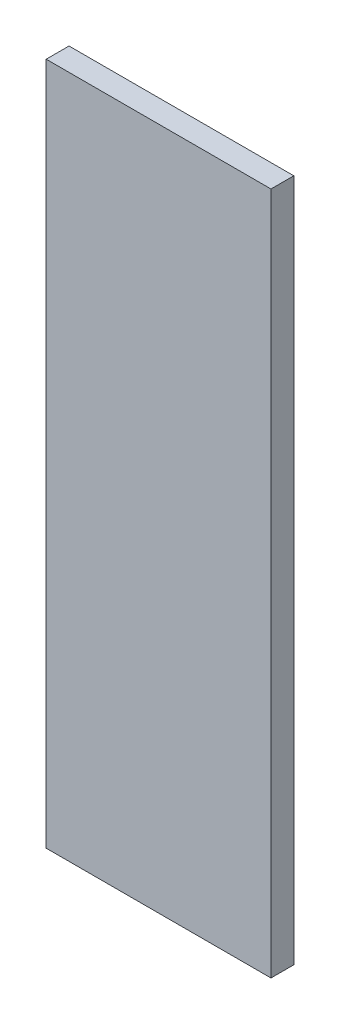
ISO-10303-21;
HEADER;
FILE_DESCRIPTION(('STEP AP214'),'2;1');
FILE_NAME('part.step','',(''),(''),'','','');
FILE_SCHEMA(('AUTOMOTIVE_DESIGN { 1 0 10303 214 1 1 1 1 }'));
ENDSEC;
DATA;
#1=APPLICATION_CONTEXT('core data for automotive mechanical design processes');
#2=APPLICATION_PROTOCOL_DEFINITION('international standard','automotive_design',2000,#1);
#3=PRODUCT_CONTEXT('',#1,'mechanical');
#4=PRODUCT('Part','Part','',(#3));
#5=PRODUCT_RELATED_PRODUCT_CATEGORY('part','',(#4));
#6=PRODUCT_DEFINITION_FORMATION('','',#4);
#7=PRODUCT_DEFINITION_CONTEXT('part definition',#1,'design');
#8=PRODUCT_DEFINITION('design','',#6,#7);
#9=PRODUCT_DEFINITION_SHAPE('','',#8);
#10=(LENGTH_UNIT() NAMED_UNIT(*) SI_UNIT(.MILLI.,.METRE.));
#11=(NAMED_UNIT(*) PLANE_ANGLE_UNIT() SI_UNIT($,.RADIAN.));
#12=(NAMED_UNIT(*) SI_UNIT($,.STERADIAN.) SOLID_ANGLE_UNIT());
#13=UNCERTAINTY_MEASURE_WITH_UNIT(LENGTH_MEASURE(1.E-05),#10,'distance_accuracy_value','');
#14=(GEOMETRIC_REPRESENTATION_CONTEXT(3) GLOBAL_UNCERTAINTY_ASSIGNED_CONTEXT((#13)) GLOBAL_UNIT_ASSIGNED_CONTEXT((#10,
#11,#12)) REPRESENTATION_CONTEXT('',''));
#15=CARTESIAN_POINT('',(0.,0.,0.));
#16=DIRECTION('',(0.,0.,1.));
#17=DIRECTION('',(1.,0.,0.));
#18=AXIS2_PLACEMENT_3D('',#15,#16,#17);
#19=CARTESIAN_POINT('',(62.5,-190.,6.35));
#20=DIRECTION('',(-1.,0.,0.));
#21=DIRECTION('',(0.,0.,1.));
#22=AXIS2_PLACEMENT_3D('',#19,#20,#21);
#23=PLANE('',#22);
#24=DIRECTION('',(0.,1.,0.));
#25=VECTOR('',#24,1.);
#26=CARTESIAN_POINT('',(62.5,-190.,-6.35));
#27=LINE('',#26,#25);
#28=CARTESIAN_POINT('',(62.5,-190.,-6.35));
#29=VERTEX_POINT('',#28);
#30=CARTESIAN_POINT('',(62.5,190.,-6.35));
#31=VERTEX_POINT('',#30);
#32=EDGE_CURVE('E100',#29,#31,#27,.T.);
#33=ORIENTED_EDGE('',*,*,#32,.T.);
#34=DIRECTION('',(0.,0.,-1.));
#35=VECTOR('',#34,1.);
#36=CARTESIAN_POINT('',(62.5,190.,6.35));
#37=LINE('',#36,#35);
#38=CARTESIAN_POINT('',(62.5,190.,6.35));
#39=VERTEX_POINT('',#38);
#40=EDGE_CURVE('E11',#39,#31,#37,.T.);
#41=ORIENTED_EDGE('',*,*,#40,.F.);
#42=DIRECTION('',(0.,1.,0.));
#43=VECTOR('',#42,1.);
#44=CARTESIAN_POINT('',(62.5,-190.,6.35));
#45=LINE('',#44,#43);
#46=CARTESIAN_POINT('',(62.5,-190.,6.35));
#47=VERTEX_POINT('',#46);
#48=EDGE_CURVE('E88',#47,#39,#45,.T.);
#49=ORIENTED_EDGE('',*,*,#48,.F.);
#50=DIRECTION('',(0.,0.,-1.));
#51=VECTOR('',#50,1.);
#52=CARTESIAN_POINT('',(62.5,-190.,6.35));
#53=LINE('',#52,#51);
#54=EDGE_CURVE('E96',#47,#29,#53,.T.);
#55=ORIENTED_EDGE('',*,*,#54,.T.);
#56=EDGE_LOOP('',(#33,#41,#49,#55));
#57=FACE_BOUND('',#56,.T.);
#58=ADVANCED_FACE('F37',(#57),#23,.F.);
#59=CARTESIAN_POINT('',(-62.5,190.,6.35));
#60=DIRECTION('',(0.,-1.,0.));
#61=DIRECTION('',(0.,0.,-1.));
#62=AXIS2_PLACEMENT_3D('',#59,#60,#61);
#63=PLANE('',#62);
#64=DIRECTION('',(-1.,0.,0.));
#65=VECTOR('',#64,1.);
#66=CARTESIAN_POINT('',(-62.5,190.,-6.35));
#67=LINE('',#66,#65);
#68=CARTESIAN_POINT('',(-62.5,190.,-6.35));
#69=VERTEX_POINT('',#68);
#70=EDGE_CURVE('E92',#31,#69,#67,.T.);
#71=ORIENTED_EDGE('',*,*,#70,.T.);
#72=DIRECTION('',(0.,0.,-1.));
#73=VECTOR('',#72,1.);
#74=CARTESIAN_POINT('',(-62.5,190.,6.35));
#75=LINE('',#74,#73);
#76=CARTESIAN_POINT('',(-62.5,190.,6.35));
#77=VERTEX_POINT('',#76);
#78=EDGE_CURVE('E45',#77,#69,#75,.T.);
#79=ORIENTED_EDGE('',*,*,#78,.F.);
#80=DIRECTION('',(-1.,0.,0.));
#81=VECTOR('',#80,1.);
#82=CARTESIAN_POINT('',(-62.5,190.,6.35));
#83=LINE('',#82,#81);
#84=EDGE_CURVE('E83',#39,#77,#83,.T.);
#85=ORIENTED_EDGE('',*,*,#84,.F.);
#86=ORIENTED_EDGE('',*,*,#40,.T.);
#87=EDGE_LOOP('',(#71,#79,#85,#86));
#88=FACE_BOUND('',#87,.T.);
#89=ADVANCED_FACE('F91',(#88),#63,.F.);
#90=CARTESIAN_POINT('',(-62.5,-190.,6.35));
#91=DIRECTION('',(1.,0.,0.));
#92=DIRECTION('',(0.,0.,-1.));
#93=AXIS2_PLACEMENT_3D('',#90,#91,#92);
#94=PLANE('',#93);
#95=DIRECTION('',(0.,-1.,0.));
#96=VECTOR('',#95,1.);
#97=CARTESIAN_POINT('',(-62.5,-190.,-6.35));
#98=LINE('',#97,#96);
#99=CARTESIAN_POINT('',(-62.5,-190.,-6.35));
#100=VERTEX_POINT('',#99);
#101=EDGE_CURVE('E70',#69,#100,#98,.T.);
#102=ORIENTED_EDGE('',*,*,#101,.T.);
#103=DIRECTION('',(0.,0.,-1.));
#104=VECTOR('',#103,1.);
#105=CARTESIAN_POINT('',(-62.5,-190.,6.35));
#106=LINE('',#105,#104);
#107=CARTESIAN_POINT('',(-62.5,-190.,6.35));
#108=VERTEX_POINT('',#107);
#109=EDGE_CURVE('E93',#108,#100,#106,.T.);
#110=ORIENTED_EDGE('',*,*,#109,.F.);
#111=DIRECTION('',(0.,-1.,0.));
#112=VECTOR('',#111,1.);
#113=CARTESIAN_POINT('',(-62.5,-190.,6.35));
#114=LINE('',#113,#112);
#115=EDGE_CURVE('E86',#77,#108,#114,.T.);
#116=ORIENTED_EDGE('',*,*,#115,.F.);
#117=ORIENTED_EDGE('',*,*,#78,.T.);
#118=EDGE_LOOP('',(#102,#110,#116,#117));
#119=FACE_BOUND('',#118,.T.);
#120=ADVANCED_FACE('F94',(#119),#94,.F.);
#121=CARTESIAN_POINT('',(-62.5,-190.,6.35));
#122=DIRECTION('',(0.,1.,0.));
#123=DIRECTION('',(0.,0.,1.));
#124=AXIS2_PLACEMENT_3D('',#121,#122,#123);
#125=PLANE('',#124);
#126=DIRECTION('',(1.,0.,0.));
#127=VECTOR('',#126,1.);
#128=CARTESIAN_POINT('',(-62.5,-190.,-6.35));
#129=LINE('',#128,#127);
#130=EDGE_CURVE('E76',#100,#29,#129,.T.);
#131=ORIENTED_EDGE('',*,*,#130,.T.);
#132=ORIENTED_EDGE('',*,*,#54,.F.);
#133=DIRECTION('',(1.,0.,0.));
#134=VECTOR('',#133,1.);
#135=CARTESIAN_POINT('',(-62.5,-190.,6.35));
#136=LINE('',#135,#134);
#137=EDGE_CURVE('E53',#108,#47,#136,.T.);
#138=ORIENTED_EDGE('',*,*,#137,.F.);
#139=ORIENTED_EDGE('',*,*,#109,.T.);
#140=EDGE_LOOP('',(#131,#132,#138,#139));
#141=FACE_BOUND('',#140,.T.);
#142=ADVANCED_FACE('F107',(#141),#125,.F.);
#143=CARTESIAN_POINT('',(0.,0.,6.35));
#144=DIRECTION('',(0.,0.,-1.));
#145=DIRECTION('',(-1.,0.,0.));
#146=AXIS2_PLACEMENT_3D('',#143,#144,#145);
#147=PLANE('',#146);
#148=ORIENTED_EDGE('',*,*,#48,.T.);
#149=ORIENTED_EDGE('',*,*,#84,.T.);
#150=ORIENTED_EDGE('',*,*,#115,.T.);
#151=ORIENTED_EDGE('',*,*,#137,.T.);
#152=EDGE_LOOP('',(#148,#149,#150,#151));
#153=FACE_BOUND('',#152,.T.);
#154=ADVANCED_FACE('F84',(#153),#147,.F.);
#155=CARTESIAN_POINT('',(0.,0.,-6.35));
#156=DIRECTION('',(0.,0.,-1.));
#157=DIRECTION('',(-1.,0.,0.));
#158=AXIS2_PLACEMENT_3D('',#155,#156,#157);
#159=PLANE('',#158);
#160=ORIENTED_EDGE('',*,*,#32,.F.);
#161=ORIENTED_EDGE('',*,*,#130,.F.);
#162=ORIENTED_EDGE('',*,*,#101,.F.);
#163=ORIENTED_EDGE('',*,*,#70,.F.);
#164=EDGE_LOOP('',(#160,#161,#162,#163));
#165=FACE_BOUND('',#164,.T.);
#166=ADVANCED_FACE('F110',(#165),#159,.T.);
#167=CLOSED_SHELL('',(#58,#89,#120,#142,#154,#166));
#168=MANIFOLD_SOLID_BREP('B2',#167);
#169=ADVANCED_BREP_SHAPE_REPRESENTATION('',(#18,#168),#14);
#170=SHAPE_DEFINITION_REPRESENTATION(#9,#169);
ENDSEC;
END-ISO-10303-21;
